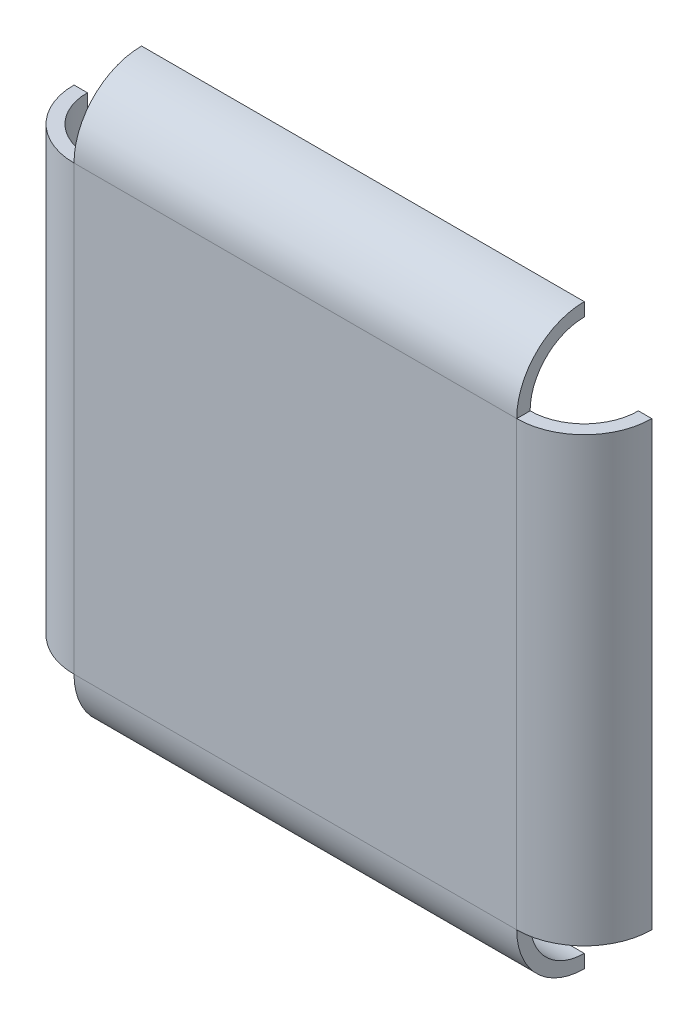
ISO-10303-21;
HEADER;
FILE_DESCRIPTION(('STEP AP214'),'2;1');
FILE_NAME('part.step','',(''),(''),'','','');
FILE_SCHEMA(('AUTOMOTIVE_DESIGN { 1 0 10303 214 1 1 1 1 }'));
ENDSEC;
DATA;
#1=APPLICATION_CONTEXT('core data for automotive mechanical design processes');
#2=APPLICATION_PROTOCOL_DEFINITION('international standard','automotive_design',2000,#1);
#3=PRODUCT_CONTEXT('',#1,'mechanical');
#4=PRODUCT('Part','Part','',(#3));
#5=PRODUCT_RELATED_PRODUCT_CATEGORY('part','',(#4));
#6=PRODUCT_DEFINITION_FORMATION('','',#4);
#7=PRODUCT_DEFINITION_CONTEXT('part definition',#1,'design');
#8=PRODUCT_DEFINITION('design','',#6,#7);
#9=PRODUCT_DEFINITION_SHAPE('','',#8);
#10=(LENGTH_UNIT() NAMED_UNIT(*) SI_UNIT(.MILLI.,.METRE.));
#11=(NAMED_UNIT(*) PLANE_ANGLE_UNIT() SI_UNIT($,.RADIAN.));
#12=(NAMED_UNIT(*) SI_UNIT($,.STERADIAN.) SOLID_ANGLE_UNIT());
#13=UNCERTAINTY_MEASURE_WITH_UNIT(LENGTH_MEASURE(1.E-05),#10,'distance_accuracy_value','');
#14=(GEOMETRIC_REPRESENTATION_CONTEXT(3) GLOBAL_UNCERTAINTY_ASSIGNED_CONTEXT((#13)) GLOBAL_UNIT_ASSIGNED_CONTEXT((#10,
#11,#12)) REPRESENTATION_CONTEXT('',''));
#15=CARTESIAN_POINT('',(0.,0.,0.));
#16=DIRECTION('',(0.,0.,1.));
#17=DIRECTION('',(1.,0.,0.));
#18=AXIS2_PLACEMENT_3D('',#15,#16,#17);
#19=CARTESIAN_POINT('',(-50.4800000659996,50.480000066,-47.305000066));
#20=DIRECTION('',(-1.,0.,0.));
#21=DIRECTION('',(0.,0.,1.));
#22=AXIS2_PLACEMENT_3D('',#19,#20,#21);
#23=PLANE('',#22);
#24=DIRECTION('',(0.,-1.,0.));
#25=VECTOR('',#24,1.);
#26=CARTESIAN_POINT('',(-50.4800000659996,0.,-47.305000066));
#27=LINE('',#26,#25);
#28=CARTESIAN_POINT('',(-50.4800000659996,10.,-47.305000066));
#29=VERTEX_POINT('',#28);
#30=CARTESIAN_POINT('',(-50.4800000659996,0.,-47.305000066));
#31=VERTEX_POINT('',#30);
#32=EDGE_CURVE('E11',#29,#31,#27,.T.);
#33=ORIENTED_EDGE('',*,*,#32,.F.);
#34=CARTESIAN_POINT('',(-50.4800000659996,50.480000066,-47.305000066));
#35=DIRECTION('',(-1.,0.,0.));
#36=DIRECTION('',(0.,0.,1.));
#37=AXIS2_PLACEMENT_3D('',#34,#35,#36);
#38=CIRCLE('',#37,40.480000066);
#39=CARTESIAN_POINT('',(-50.4800000659996,50.4800000659997,-6.825));
#40=VERTEX_POINT('',#39);
#41=EDGE_CURVE('E121',#29,#40,#38,.T.);
#42=ORIENTED_EDGE('',*,*,#41,.T.);
#43=DIRECTION('',(0.,0.,1.));
#44=VECTOR('',#43,1.);
#45=CARTESIAN_POINT('',(-50.4800000659996,50.4800000659996,3.175));
#46=LINE('',#45,#44);
#47=CARTESIAN_POINT('',(-50.4800000659996,50.4800000659996,3.175));
#48=VERTEX_POINT('',#47);
#49=EDGE_CURVE('E45',#40,#48,#46,.T.);
#50=ORIENTED_EDGE('',*,*,#49,.T.);
#51=CARTESIAN_POINT('',(-50.4800000659996,50.480000066,-47.305000066));
#52=DIRECTION('',(1.,0.,0.));
#53=DIRECTION('',(0.,0.,-1.));
#54=AXIS2_PLACEMENT_3D('',#51,#52,#53);
#55=CIRCLE('',#54,50.480000066);
#56=EDGE_CURVE('E157',#31,#48,#55,.F.);
#57=ORIENTED_EDGE('',*,*,#56,.F.);
#58=EDGE_LOOP('',(#33,#42,#50,#57));
#59=FACE_BOUND('',#58,.T.);
#60=ADVANCED_FACE('F35',(#59),#23,.F.);
#61=CARTESIAN_POINT('',(-50.480000066,50.4800000659996,-47.305000066));
#62=DIRECTION('',(0.,1.,0.));
#63=DIRECTION('',(0.,0.,1.));
#64=AXIS2_PLACEMENT_3D('',#61,#62,#63);
#65=PLANE('',#64);
#66=ORIENTED_EDGE('',*,*,#49,.F.);
#67=CARTESIAN_POINT('',(-50.480000066,50.4800000659996,-47.305000066));
#68=DIRECTION('',(0.,-1.,0.));
#69=DIRECTION('',(0.,0.,-1.));
#70=AXIS2_PLACEMENT_3D('',#67,#68,#69);
#71=CIRCLE('',#70,40.480000066);
#72=CARTESIAN_POINT('',(-10.,50.4800000659996,-47.305000066));
#73=VERTEX_POINT('',#72);
#74=EDGE_CURVE('E229',#40,#73,#71,.F.);
#75=ORIENTED_EDGE('',*,*,#74,.T.);
#76=DIRECTION('',(1.,0.,0.));
#77=VECTOR('',#76,1.);
#78=CARTESIAN_POINT('',(0.,50.4800000659996,-47.305000066));
#79=LINE('',#78,#77);
#80=CARTESIAN_POINT('',(0.,50.4800000659996,-47.305000066));
#81=VERTEX_POINT('',#80);
#82=EDGE_CURVE('E53',#73,#81,#79,.T.);
#83=ORIENTED_EDGE('',*,*,#82,.T.);
#84=CARTESIAN_POINT('',(-50.480000066,50.4800000659996,-47.305000066));
#85=DIRECTION('',(0.,-1.,0.));
#86=DIRECTION('',(0.,0.,-1.));
#87=AXIS2_PLACEMENT_3D('',#84,#85,#86);
#88=CIRCLE('',#87,50.480000066);
#89=EDGE_CURVE('E169',#48,#81,#88,.F.);
#90=ORIENTED_EDGE('',*,*,#89,.F.);
#91=EDGE_LOOP('',(#66,#75,#83,#90));
#92=FACE_BOUND('',#91,.T.);
#93=ADVANCED_FACE('F170',(#92),#65,.F.);
#94=CARTESIAN_POINT('',(0.,215.9,-47.305000066));
#95=DIRECTION('',(0.,0.,-1.));
#96=DIRECTION('',(0.,1.,0.));
#97=AXIS2_PLACEMENT_3D('',#94,#95,#96);
#98=PLANE('',#97);
#99=ORIENTED_EDGE('',*,*,#82,.F.);
#100=DIRECTION('',(0.,-1.,0.));
#101=VECTOR('',#100,1.);
#102=CARTESIAN_POINT('',(-10.,0.,-47.305000066));
#103=LINE('',#102,#101);
#104=CARTESIAN_POINT('',(-10.,381.319999934,-47.305000066));
#105=VERTEX_POINT('',#104);
#106=EDGE_CURVE('E221',#73,#105,#103,.F.);
#107=ORIENTED_EDGE('',*,*,#106,.T.);
#108=DIRECTION('',(1.,0.,0.));
#109=VECTOR('',#108,1.);
#110=CARTESIAN_POINT('',(0.,381.319999934,-47.305000066));
#111=LINE('',#110,#109);
#112=CARTESIAN_POINT('',(0.,381.319999934,-47.305000066));
#113=VERTEX_POINT('',#112);
#114=EDGE_CURVE('E150',#105,#113,#111,.T.);
#115=ORIENTED_EDGE('',*,*,#114,.T.);
#116=DIRECTION('',(0.,1.,0.));
#117=VECTOR('',#116,1.);
#118=CARTESIAN_POINT('',(0.,50.4800000659996,-47.305000066));
#119=LINE('',#118,#117);
#120=EDGE_CURVE('E175',#81,#113,#119,.T.);
#121=ORIENTED_EDGE('',*,*,#120,.F.);
#122=EDGE_LOOP('',(#99,#107,#115,#121));
#123=FACE_BOUND('',#122,.T.);
#124=ADVANCED_FACE('F238',(#123),#98,.T.);
#125=CARTESIAN_POINT('',(-50.480000066,381.319999934,-47.305000066));
#126=DIRECTION('',(0.,-1.,0.));
#127=DIRECTION('',(0.,0.,-1.));
#128=AXIS2_PLACEMENT_3D('',#125,#126,#127);
#129=PLANE('',#128);
#130=ORIENTED_EDGE('',*,*,#114,.F.);
#131=CARTESIAN_POINT('',(-50.480000066,381.319999934,-47.305000066));
#132=DIRECTION('',(0.,-1.,0.));
#133=DIRECTION('',(0.,0.,-1.));
#134=AXIS2_PLACEMENT_3D('',#131,#132,#133);
#135=CIRCLE('',#134,40.480000066);
#136=CARTESIAN_POINT('',(-50.4800000659997,381.319999934,-6.825));
#137=VERTEX_POINT('',#136);
#138=EDGE_CURVE('E226',#105,#137,#135,.T.);
#139=ORIENTED_EDGE('',*,*,#138,.T.);
#140=DIRECTION('',(0.,0.,1.));
#141=VECTOR('',#140,1.);
#142=CARTESIAN_POINT('',(-50.4800000659996,381.319999934,3.175));
#143=LINE('',#142,#141);
#144=CARTESIAN_POINT('',(-50.4800000659996,381.319999934,3.175));
#145=VERTEX_POINT('',#144);
#146=EDGE_CURVE('E147',#137,#145,#143,.T.);
#147=ORIENTED_EDGE('',*,*,#146,.T.);
#148=CARTESIAN_POINT('',(-50.480000066,381.319999934,-47.305000066));
#149=DIRECTION('',(0.,1.,0.));
#150=DIRECTION('',(0.,0.,1.));
#151=AXIS2_PLACEMENT_3D('',#148,#149,#150);
#152=CIRCLE('',#151,50.480000066);
#153=EDGE_CURVE('E176',#113,#145,#152,.F.);
#154=ORIENTED_EDGE('',*,*,#153,.F.);
#155=EDGE_LOOP('',(#130,#139,#147,#154));
#156=FACE_BOUND('',#155,.T.);
#157=ADVANCED_FACE('F240',(#156),#129,.F.);
#158=CARTESIAN_POINT('',(-50.4800000659996,381.319999934,-47.305000066));
#159=DIRECTION('',(-1.,0.,0.));
#160=DIRECTION('',(0.,-1.,0.));
#161=AXIS2_PLACEMENT_3D('',#158,#159,#160);
#162=PLANE('',#161);
#163=ORIENTED_EDGE('',*,*,#146,.F.);
#164=CARTESIAN_POINT('',(-50.4800000659996,381.319999934,-47.305000066));
#165=DIRECTION('',(1.,0.,0.));
#166=DIRECTION('',(0.,1.,0.));
#167=AXIS2_PLACEMENT_3D('',#164,#165,#166);
#168=CIRCLE('',#167,40.480000066);
#169=CARTESIAN_POINT('',(-50.4800000659996,421.8,-47.305000066));
#170=VERTEX_POINT('',#169);
#171=EDGE_CURVE('E220',#137,#170,#168,.F.);
#172=ORIENTED_EDGE('',*,*,#171,.T.);
#173=DIRECTION('',(0.,1.,0.));
#174=VECTOR('',#173,1.);
#175=CARTESIAN_POINT('',(-50.4800000659996,431.8,-47.305000066));
#176=LINE('',#175,#174);
#177=CARTESIAN_POINT('',(-50.4800000659996,431.8,-47.305000066));
#178=VERTEX_POINT('',#177);
#179=EDGE_CURVE('E144',#170,#178,#176,.T.);
#180=ORIENTED_EDGE('',*,*,#179,.T.);
#181=CARTESIAN_POINT('',(-50.4800000659996,381.319999934,-47.305000066));
#182=DIRECTION('',(1.,0.,0.));
#183=DIRECTION('',(0.,1.,0.));
#184=AXIS2_PLACEMENT_3D('',#181,#182,#183);
#185=CIRCLE('',#184,50.480000066);
#186=EDGE_CURVE('E247',#145,#178,#185,.F.);
#187=ORIENTED_EDGE('',*,*,#186,.F.);
#188=EDGE_LOOP('',(#163,#172,#180,#187));
#189=FACE_BOUND('',#188,.T.);
#190=ADVANCED_FACE('F244',(#189),#162,.F.);
#191=CARTESIAN_POINT('',(-215.9,431.8,-47.305000066));
#192=DIRECTION('',(0.,0.,-1.));
#193=DIRECTION('',(-1.,0.,0.));
#194=AXIS2_PLACEMENT_3D('',#191,#192,#193);
#195=PLANE('',#194);
#196=ORIENTED_EDGE('',*,*,#179,.F.);
#197=DIRECTION('',(1.,0.,0.));
#198=VECTOR('',#197,1.);
#199=CARTESIAN_POINT('',(0.,421.8,-47.305000066));
#200=LINE('',#199,#198);
#201=CARTESIAN_POINT('',(-381.319999934,421.8,-47.305000066));
#202=VERTEX_POINT('',#201);
#203=EDGE_CURVE('E211',#170,#202,#200,.F.);
#204=ORIENTED_EDGE('',*,*,#203,.T.);
#205=DIRECTION('',(0.,1.,0.));
#206=VECTOR('',#205,1.);
#207=CARTESIAN_POINT('',(-381.319999934,431.8,-47.305000066));
#208=LINE('',#207,#206);
#209=CARTESIAN_POINT('',(-381.319999934,431.8,-47.305000066));
#210=VERTEX_POINT('',#209);
#211=EDGE_CURVE('E141',#202,#210,#208,.T.);
#212=ORIENTED_EDGE('',*,*,#211,.T.);
#213=DIRECTION('',(-1.,0.,0.));
#214=VECTOR('',#213,1.);
#215=CARTESIAN_POINT('',(-50.4800000659996,431.8,-47.305000066));
#216=LINE('',#215,#214);
#217=EDGE_CURVE('E196',#178,#210,#216,.T.);
#218=ORIENTED_EDGE('',*,*,#217,.F.);
#219=EDGE_LOOP('',(#196,#204,#212,#218));
#220=FACE_BOUND('',#219,.T.);
#221=ADVANCED_FACE('F275',(#220),#195,.T.);
#222=CARTESIAN_POINT('',(-381.319999934,381.319999934,-47.305000066));
#223=DIRECTION('',(1.,0.,0.));
#224=DIRECTION('',(0.,0.,-1.));
#225=AXIS2_PLACEMENT_3D('',#222,#223,#224);
#226=PLANE('',#225);
#227=ORIENTED_EDGE('',*,*,#211,.F.);
#228=CARTESIAN_POINT('',(-381.319999934,381.319999934,-47.305000066));
#229=DIRECTION('',(1.,0.,0.));
#230=DIRECTION('',(0.,1.,0.));
#231=AXIS2_PLACEMENT_3D('',#228,#229,#230);
#232=CIRCLE('',#231,40.480000066);
#233=CARTESIAN_POINT('',(-381.319999934,381.319999934,-6.825));
#234=VERTEX_POINT('',#233);
#235=EDGE_CURVE('E217',#202,#234,#232,.T.);
#236=ORIENTED_EDGE('',*,*,#235,.T.);
#237=DIRECTION('',(0.,0.,1.));
#238=VECTOR('',#237,1.);
#239=CARTESIAN_POINT('',(-381.319999934,381.319999934,3.175));
#240=LINE('',#239,#238);
#241=CARTESIAN_POINT('',(-381.319999934,381.319999934,3.175));
#242=VERTEX_POINT('',#241);
#243=EDGE_CURVE('E138',#234,#242,#240,.T.);
#244=ORIENTED_EDGE('',*,*,#243,.T.);
#245=CARTESIAN_POINT('',(-381.319999934,381.319999934,-47.305000066));
#246=DIRECTION('',(-1.,0.,0.));
#247=DIRECTION('',(0.,0.,1.));
#248=AXIS2_PLACEMENT_3D('',#245,#246,#247);
#249=CIRCLE('',#248,50.480000066);
#250=EDGE_CURVE('E200',#210,#242,#249,.F.);
#251=ORIENTED_EDGE('',*,*,#250,.F.);
#252=EDGE_LOOP('',(#227,#236,#244,#251));
#253=FACE_BOUND('',#252,.T.);
#254=ADVANCED_FACE('F282',(#253),#226,.F.);
#255=CARTESIAN_POINT('',(-381.319999934,381.319999934,-47.305000066));
#256=DIRECTION('',(0.,-1.,0.));
#257=DIRECTION('',(0.,0.,-1.));
#258=AXIS2_PLACEMENT_3D('',#255,#256,#257);
#259=PLANE('',#258);
#260=ORIENTED_EDGE('',*,*,#243,.F.);
#261=CARTESIAN_POINT('',(-381.319999934,381.319999934,-47.305000066));
#262=DIRECTION('',(0.,1.,0.));
#263=DIRECTION('',(0.,0.,1.));
#264=AXIS2_PLACEMENT_3D('',#261,#262,#263);
#265=CIRCLE('',#264,40.480000066);
#266=CARTESIAN_POINT('',(-421.8,381.319999934,-47.305000066));
#267=VERTEX_POINT('',#266);
#268=EDGE_CURVE('E210',#234,#267,#265,.F.);
#269=ORIENTED_EDGE('',*,*,#268,.T.);
#270=DIRECTION('',(-1.,0.,0.));
#271=VECTOR('',#270,1.);
#272=CARTESIAN_POINT('',(-431.8,381.319999934,-47.305000066));
#273=LINE('',#272,#271);
#274=CARTESIAN_POINT('',(-431.8,381.319999934,-47.305000066));
#275=VERTEX_POINT('',#274);
#276=EDGE_CURVE('E135',#267,#275,#273,.T.);
#277=ORIENTED_EDGE('',*,*,#276,.T.);
#278=CARTESIAN_POINT('',(-381.319999934,381.319999934,-47.305000066));
#279=DIRECTION('',(0.,1.,0.));
#280=DIRECTION('',(0.,0.,1.));
#281=AXIS2_PLACEMENT_3D('',#278,#279,#280);
#282=CIRCLE('',#281,50.480000066);
#283=EDGE_CURVE('E257',#242,#275,#282,.F.);
#284=ORIENTED_EDGE('',*,*,#283,.F.);
#285=EDGE_LOOP('',(#260,#269,#277,#284));
#286=FACE_BOUND('',#285,.T.);
#287=ADVANCED_FACE('F284',(#286),#259,.F.);
#288=CARTESIAN_POINT('',(-431.8,215.9,-47.305000066));
#289=DIRECTION('',(0.,0.,-1.));
#290=DIRECTION('',(0.,-1.,0.));
#291=AXIS2_PLACEMENT_3D('',#288,#289,#290);
#292=PLANE('',#291);
#293=ORIENTED_EDGE('',*,*,#276,.F.);
#294=DIRECTION('',(0.,1.,0.));
#295=VECTOR('',#294,1.);
#296=CARTESIAN_POINT('',(-421.8,0.,-47.305000066));
#297=LINE('',#296,#295);
#298=CARTESIAN_POINT('',(-421.8,50.4800000659996,-47.305000066));
#299=VERTEX_POINT('',#298);
#300=EDGE_CURVE('E212',#267,#299,#297,.F.);
#301=ORIENTED_EDGE('',*,*,#300,.T.);
#302=DIRECTION('',(-1.,0.,0.));
#303=VECTOR('',#302,1.);
#304=CARTESIAN_POINT('',(-431.8,50.4800000659996,-47.305000066));
#305=LINE('',#304,#303);
#306=CARTESIAN_POINT('',(-431.8,50.4800000659996,-47.305000066));
#307=VERTEX_POINT('',#306);
#308=EDGE_CURVE('E132',#299,#307,#305,.T.);
#309=ORIENTED_EDGE('',*,*,#308,.T.);
#310=DIRECTION('',(0.,-1.,0.));
#311=VECTOR('',#310,1.);
#312=CARTESIAN_POINT('',(-431.8,381.319999934,-47.305000066));
#313=LINE('',#312,#311);
#314=EDGE_CURVE('E167',#275,#307,#313,.T.);
#315=ORIENTED_EDGE('',*,*,#314,.F.);
#316=EDGE_LOOP('',(#293,#301,#309,#315));
#317=FACE_BOUND('',#316,.T.);
#318=ADVANCED_FACE('F297',(#317),#292,.T.);
#319=CARTESIAN_POINT('',(-381.319999934,50.4800000659996,-47.305000066));
#320=DIRECTION('',(0.,1.,0.));
#321=DIRECTION('',(0.,0.,1.));
#322=AXIS2_PLACEMENT_3D('',#319,#320,#321);
#323=PLANE('',#322);
#324=ORIENTED_EDGE('',*,*,#308,.F.);
#325=CARTESIAN_POINT('',(-381.319999934,50.4800000659996,-47.305000066));
#326=DIRECTION('',(0.,1.,0.));
#327=DIRECTION('',(0.,0.,1.));
#328=AXIS2_PLACEMENT_3D('',#325,#326,#327);
#329=CIRCLE('',#328,40.480000066);
#330=CARTESIAN_POINT('',(-381.319999934,50.4800000659996,-6.825));
#331=VERTEX_POINT('',#330);
#332=EDGE_CURVE('E208',#299,#331,#329,.T.);
#333=ORIENTED_EDGE('',*,*,#332,.T.);
#334=DIRECTION('',(0.,0.,1.));
#335=VECTOR('',#334,1.);
#336=CARTESIAN_POINT('',(-381.319999934,50.4800000659996,3.175));
#337=LINE('',#336,#335);
#338=CARTESIAN_POINT('',(-381.319999934,50.4800000659996,3.175));
#339=VERTEX_POINT('',#338);
#340=EDGE_CURVE('E111',#331,#339,#337,.T.);
#341=ORIENTED_EDGE('',*,*,#340,.T.);
#342=CARTESIAN_POINT('',(-381.319999934,50.4800000659996,-47.305000066));
#343=DIRECTION('',(0.,-1.,0.));
#344=DIRECTION('',(0.,0.,-1.));
#345=AXIS2_PLACEMENT_3D('',#342,#343,#344);
#346=CIRCLE('',#345,50.480000066);
#347=EDGE_CURVE('E251',#307,#339,#346,.F.);
#348=ORIENTED_EDGE('',*,*,#347,.F.);
#349=EDGE_LOOP('',(#324,#333,#341,#348));
#350=FACE_BOUND('',#349,.T.);
#351=ADVANCED_FACE('F301',(#350),#323,.F.);
#352=CARTESIAN_POINT('',(-381.319999934,50.480000066,-47.305000066));
#353=DIRECTION('',(1.,0.,0.));
#354=DIRECTION('',(0.,0.,-1.));
#355=AXIS2_PLACEMENT_3D('',#352,#353,#354);
#356=PLANE('',#355);
#357=ORIENTED_EDGE('',*,*,#340,.F.);
#358=CARTESIAN_POINT('',(-381.319999934,50.480000066,-47.305000066));
#359=DIRECTION('',(-1.,0.,0.));
#360=DIRECTION('',(0.,0.,1.));
#361=AXIS2_PLACEMENT_3D('',#358,#359,#360);
#362=CIRCLE('',#361,40.480000066);
#363=CARTESIAN_POINT('',(-381.319999934,10.,-47.305000066));
#364=VERTEX_POINT('',#363);
#365=EDGE_CURVE('E114',#331,#364,#362,.F.);
#366=ORIENTED_EDGE('',*,*,#365,.T.);
#367=DIRECTION('',(0.,-1.,0.));
#368=VECTOR('',#367,1.);
#369=CARTESIAN_POINT('',(-381.319999934,0.,-47.305000066));
#370=LINE('',#369,#368);
#371=CARTESIAN_POINT('',(-381.319999934,0.,-47.305000066));
#372=VERTEX_POINT('',#371);
#373=EDGE_CURVE('E39',#364,#372,#370,.T.);
#374=ORIENTED_EDGE('',*,*,#373,.T.);
#375=CARTESIAN_POINT('',(-381.319999934,50.480000066,-47.305000066));
#376=DIRECTION('',(-1.,0.,0.));
#377=DIRECTION('',(0.,0.,1.));
#378=AXIS2_PLACEMENT_3D('',#375,#376,#377);
#379=CIRCLE('',#378,50.480000066);
#380=EDGE_CURVE('E166',#339,#372,#379,.F.);
#381=ORIENTED_EDGE('',*,*,#380,.F.);
#382=EDGE_LOOP('',(#357,#366,#374,#381));
#383=FACE_BOUND('',#382,.T.);
#384=ADVANCED_FACE('F115',(#383),#356,.F.);
#385=CARTESIAN_POINT('',(-215.9,0.,-47.305000066));
#386=DIRECTION('',(0.,0.,-1.));
#387=DIRECTION('',(1.,0.,0.));
#388=AXIS2_PLACEMENT_3D('',#385,#386,#387);
#389=PLANE('',#388);
#390=DIRECTION('',(-1.,0.,0.));
#391=VECTOR('',#390,1.);
#392=CARTESIAN_POINT('',(0.,10.,-47.305000066));
#393=LINE('',#392,#391);
#394=EDGE_CURVE('E104',#364,#29,#393,.F.);
#395=ORIENTED_EDGE('',*,*,#394,.T.);
#396=ORIENTED_EDGE('',*,*,#32,.T.);
#397=DIRECTION('',(1.,0.,0.));
#398=VECTOR('',#397,1.);
#399=CARTESIAN_POINT('',(-381.319999934,0.,-47.305000066));
#400=LINE('',#399,#398);
#401=EDGE_CURVE('E107',#372,#31,#400,.T.);
#402=ORIENTED_EDGE('',*,*,#401,.F.);
#403=ORIENTED_EDGE('',*,*,#373,.F.);
#404=EDGE_LOOP('',(#395,#396,#402,#403));
#405=FACE_BOUND('',#404,.T.);
#406=ADVANCED_FACE('F37',(#405),#389,.T.);
#407=CARTESIAN_POINT('',(0.,0.,3.175));
#408=DIRECTION('',(0.,0.,1.));
#409=DIRECTION('',(1.,0.,0.));
#410=AXIS2_PLACEMENT_3D('',#407,#408,#409);
#411=PLANE('',#410);
#412=DIRECTION('',(1.,0.,0.));
#413=VECTOR('',#412,1.);
#414=CARTESIAN_POINT('',(-50.4800000659996,50.480000066,3.175));
#415=LINE('',#414,#413);
#416=EDGE_CURVE('E165',#339,#48,#415,.T.);
#417=ORIENTED_EDGE('',*,*,#416,.T.);
#418=DIRECTION('',(0.,1.,0.));
#419=VECTOR('',#418,1.);
#420=CARTESIAN_POINT('',(-50.480000066,381.319999934,3.175));
#421=LINE('',#420,#419);
#422=EDGE_CURVE('E112',#48,#145,#421,.T.);
#423=ORIENTED_EDGE('',*,*,#422,.T.);
#424=DIRECTION('',(-1.,0.,0.));
#425=VECTOR('',#424,1.);
#426=CARTESIAN_POINT('',(-381.319999934,381.319999934,3.175));
#427=LINE('',#426,#425);
#428=EDGE_CURVE('E191',#145,#242,#427,.T.);
#429=ORIENTED_EDGE('',*,*,#428,.T.);
#430=DIRECTION('',(0.,-1.,0.));
#431=VECTOR('',#430,1.);
#432=CARTESIAN_POINT('',(-381.319999934,50.4800000659996,3.175));
#433=LINE('',#432,#431);
#434=EDGE_CURVE('E185',#242,#339,#433,.T.);
#435=ORIENTED_EDGE('',*,*,#434,.T.);
#436=EDGE_LOOP('',(#417,#423,#429,#435));
#437=FACE_BOUND('',#436,.T.);
#438=ADVANCED_FACE('F181',(#437),#411,.T.);
#439=CARTESIAN_POINT('',(0.,50.480000066,-47.305000066));
#440=DIRECTION('',(-1.,0.,0.));
#441=DIRECTION('',(0.,0.,1.));
#442=AXIS2_PLACEMENT_3D('',#439,#440,#441);
#443=CYLINDRICAL_SURFACE('',#442,50.480000066);
#444=ORIENTED_EDGE('',*,*,#380,.T.);
#445=ORIENTED_EDGE('',*,*,#401,.T.);
#446=ORIENTED_EDGE('',*,*,#56,.T.);
#447=ORIENTED_EDGE('',*,*,#416,.F.);
#448=EDGE_LOOP('',(#444,#445,#446,#447));
#449=FACE_BOUND('',#448,.T.);
#450=ADVANCED_FACE('F163',(#449),#443,.T.);
#451=CARTESIAN_POINT('',(-381.319999934,0.,-47.305000066));
#452=DIRECTION('',(0.,1.,0.));
#453=DIRECTION('',(0.,0.,1.));
#454=AXIS2_PLACEMENT_3D('',#451,#452,#453);
#455=CYLINDRICAL_SURFACE('',#454,50.480000066);
#456=ORIENTED_EDGE('',*,*,#283,.T.);
#457=ORIENTED_EDGE('',*,*,#314,.T.);
#458=ORIENTED_EDGE('',*,*,#347,.T.);
#459=ORIENTED_EDGE('',*,*,#434,.F.);
#460=EDGE_LOOP('',(#456,#457,#458,#459));
#461=FACE_BOUND('',#460,.T.);
#462=ADVANCED_FACE('F300',(#461),#455,.T.);
#463=CARTESIAN_POINT('',(0.,381.319999934,-47.305000066));
#464=DIRECTION('',(1.,0.,0.));
#465=DIRECTION('',(0.,1.,0.));
#466=AXIS2_PLACEMENT_3D('',#463,#464,#465);
#467=CYLINDRICAL_SURFACE('',#466,50.480000066);
#468=ORIENTED_EDGE('',*,*,#186,.T.);
#469=ORIENTED_EDGE('',*,*,#217,.T.);
#470=ORIENTED_EDGE('',*,*,#250,.T.);
#471=ORIENTED_EDGE('',*,*,#428,.F.);
#472=EDGE_LOOP('',(#468,#469,#470,#471));
#473=FACE_BOUND('',#472,.T.);
#474=ADVANCED_FACE('F280',(#473),#467,.T.);
#475=CARTESIAN_POINT('',(-50.480000066,0.,-47.305000066));
#476=DIRECTION('',(0.,-1.,0.));
#477=DIRECTION('',(0.,0.,-1.));
#478=AXIS2_PLACEMENT_3D('',#475,#476,#477);
#479=CYLINDRICAL_SURFACE('',#478,50.480000066);
#480=ORIENTED_EDGE('',*,*,#89,.T.);
#481=ORIENTED_EDGE('',*,*,#120,.T.);
#482=ORIENTED_EDGE('',*,*,#153,.T.);
#483=ORIENTED_EDGE('',*,*,#422,.F.);
#484=EDGE_LOOP('',(#480,#481,#482,#483));
#485=FACE_BOUND('',#484,.T.);
#486=ADVANCED_FACE('F188',(#485),#479,.T.);
#487=CARTESIAN_POINT('',(0.,0.,-6.825));
#488=DIRECTION('',(0.,0.,1.));
#489=DIRECTION('',(1.,0.,0.));
#490=AXIS2_PLACEMENT_3D('',#487,#488,#489);
#491=PLANE('',#490);
#492=DIRECTION('',(1.,0.,0.));
#493=VECTOR('',#492,1.);
#494=CARTESIAN_POINT('',(0.,50.4800000659996,-6.825));
#495=LINE('',#494,#493);
#496=EDGE_CURVE('E124',#331,#40,#495,.T.);
#497=ORIENTED_EDGE('',*,*,#496,.F.);
#498=DIRECTION('',(0.,1.,0.));
#499=VECTOR('',#498,1.);
#500=CARTESIAN_POINT('',(-381.319999934,0.,-6.825));
#501=LINE('',#500,#499);
#502=EDGE_CURVE('E126',#234,#331,#501,.F.);
#503=ORIENTED_EDGE('',*,*,#502,.F.);
#504=DIRECTION('',(1.,0.,0.));
#505=VECTOR('',#504,1.);
#506=CARTESIAN_POINT('',(0.,381.319999934,-6.825));
#507=LINE('',#506,#505);
#508=EDGE_CURVE('E204',#137,#234,#507,.F.);
#509=ORIENTED_EDGE('',*,*,#508,.F.);
#510=DIRECTION('',(0.,1.,0.));
#511=VECTOR('',#510,1.);
#512=CARTESIAN_POINT('',(-50.4800000659996,0.,-6.825));
#513=LINE('',#512,#511);
#514=EDGE_CURVE('E198',#40,#137,#513,.T.);
#515=ORIENTED_EDGE('',*,*,#514,.F.);
#516=EDGE_LOOP('',(#497,#503,#509,#515));
#517=FACE_BOUND('',#516,.T.);
#518=ADVANCED_FACE('F291',(#517),#491,.F.);
#519=CARTESIAN_POINT('',(0.,50.480000066,-47.305000066));
#520=DIRECTION('',(-1.,0.,0.));
#521=DIRECTION('',(0.,0.,1.));
#522=AXIS2_PLACEMENT_3D('',#519,#520,#521);
#523=CYLINDRICAL_SURFACE('',#522,40.480000066);
#524=ORIENTED_EDGE('',*,*,#365,.F.);
#525=ORIENTED_EDGE('',*,*,#496,.T.);
#526=ORIENTED_EDGE('',*,*,#41,.F.);
#527=ORIENTED_EDGE('',*,*,#394,.F.);
#528=EDGE_LOOP('',(#524,#525,#526,#527));
#529=FACE_BOUND('',#528,.T.);
#530=ADVANCED_FACE('F123',(#529),#523,.F.);
#531=CARTESIAN_POINT('',(-381.319999934,0.,-47.305000066));
#532=DIRECTION('',(0.,1.,0.));
#533=DIRECTION('',(0.,0.,1.));
#534=AXIS2_PLACEMENT_3D('',#531,#532,#533);
#535=CYLINDRICAL_SURFACE('',#534,40.480000066);
#536=ORIENTED_EDGE('',*,*,#268,.F.);
#537=ORIENTED_EDGE('',*,*,#502,.T.);
#538=ORIENTED_EDGE('',*,*,#332,.F.);
#539=ORIENTED_EDGE('',*,*,#300,.F.);
#540=EDGE_LOOP('',(#536,#537,#538,#539));
#541=FACE_BOUND('',#540,.T.);
#542=ADVANCED_FACE('F295',(#541),#535,.F.);
#543=CARTESIAN_POINT('',(0.,381.319999934,-47.305000066));
#544=DIRECTION('',(1.,0.,0.));
#545=DIRECTION('',(0.,1.,0.));
#546=AXIS2_PLACEMENT_3D('',#543,#544,#545);
#547=CYLINDRICAL_SURFACE('',#546,40.480000066);
#548=ORIENTED_EDGE('',*,*,#171,.F.);
#549=ORIENTED_EDGE('',*,*,#508,.T.);
#550=ORIENTED_EDGE('',*,*,#235,.F.);
#551=ORIENTED_EDGE('',*,*,#203,.F.);
#552=EDGE_LOOP('',(#548,#549,#550,#551));
#553=FACE_BOUND('',#552,.T.);
#554=ADVANCED_FACE('F288',(#553),#547,.F.);
#555=CARTESIAN_POINT('',(-50.480000066,0.,-47.305000066));
#556=DIRECTION('',(0.,-1.,0.));
#557=DIRECTION('',(0.,0.,-1.));
#558=AXIS2_PLACEMENT_3D('',#555,#556,#557);
#559=CYLINDRICAL_SURFACE('',#558,40.480000066);
#560=ORIENTED_EDGE('',*,*,#74,.F.);
#561=ORIENTED_EDGE('',*,*,#514,.T.);
#562=ORIENTED_EDGE('',*,*,#138,.F.);
#563=ORIENTED_EDGE('',*,*,#106,.F.);
#564=EDGE_LOOP('',(#560,#561,#562,#563));
#565=FACE_BOUND('',#564,.T.);
#566=ADVANCED_FACE('F234',(#565),#559,.F.);
#567=CLOSED_SHELL('',(#60,#93,#124,#157,#190,#221,#254,#287,#318,#351,#384,#406,#438,#450,#462,
#474,#486,#518,#530,#542,#554,#566));
#568=MANIFOLD_SOLID_BREP('B2',#567);
#569=ADVANCED_BREP_SHAPE_REPRESENTATION('',(#18,#568),#14);
#570=SHAPE_DEFINITION_REPRESENTATION(#9,#569);
ENDSEC;
END-ISO-10303-21;
